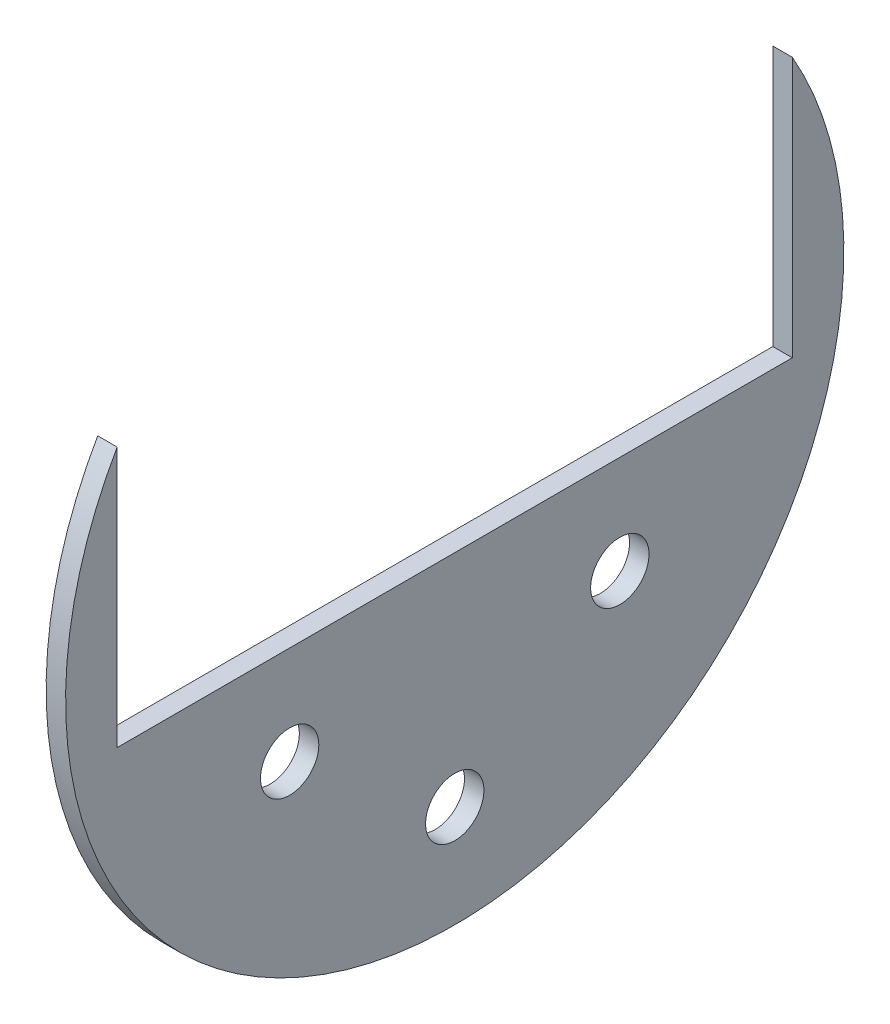
ISO-10303-21;
HEADER;
FILE_DESCRIPTION(('STEP AP214'),'2;1');
FILE_NAME('part.step','',(''),(''),'','','');
FILE_SCHEMA(('AUTOMOTIVE_DESIGN { 1 0 10303 214 1 1 1 1 }'));
ENDSEC;
DATA;
#1=APPLICATION_CONTEXT('core data for automotive mechanical design processes');
#2=APPLICATION_PROTOCOL_DEFINITION('international standard','automotive_design',2000,#1);
#3=PRODUCT_CONTEXT('',#1,'mechanical');
#4=PRODUCT('Part','Part','',(#3));
#5=PRODUCT_RELATED_PRODUCT_CATEGORY('part','',(#4));
#6=PRODUCT_DEFINITION_FORMATION('','',#4);
#7=PRODUCT_DEFINITION_CONTEXT('part definition',#1,'design');
#8=PRODUCT_DEFINITION('design','',#6,#7);
#9=PRODUCT_DEFINITION_SHAPE('','',#8);
#10=(LENGTH_UNIT() NAMED_UNIT(*) SI_UNIT(.MILLI.,.METRE.));
#11=(NAMED_UNIT(*) PLANE_ANGLE_UNIT() SI_UNIT($,.RADIAN.));
#12=(NAMED_UNIT(*) SI_UNIT($,.STERADIAN.) SOLID_ANGLE_UNIT());
#13=UNCERTAINTY_MEASURE_WITH_UNIT(LENGTH_MEASURE(1.E-05),#10,'distance_accuracy_value','');
#14=(GEOMETRIC_REPRESENTATION_CONTEXT(3) GLOBAL_UNCERTAINTY_ASSIGNED_CONTEXT((#13)) GLOBAL_UNIT_ASSIGNED_CONTEXT((#10,
#11,#12)) REPRESENTATION_CONTEXT('',''));
#15=CARTESIAN_POINT('',(0.,0.,0.));
#16=DIRECTION('',(0.,0.,1.));
#17=DIRECTION('',(1.,0.,0.));
#18=AXIS2_PLACEMENT_3D('',#15,#16,#17);
#19=CARTESIAN_POINT('',(1.,-8.48528137423807,-8.48528137423909));
#20=DIRECTION('',(-1.,0.,0.));
#21=DIRECTION('',(0.,0.,1.));
#22=AXIS2_PLACEMENT_3D('',#19,#20,#21);
#23=CYLINDRICAL_SURFACE('',#22,1.50000000000067);
#24=CARTESIAN_POINT('',(1.,-8.48528137423807,-8.48528137423909));
#25=DIRECTION('',(1.,0.,0.));
#26=DIRECTION('',(0.,0.,-1.));
#27=AXIS2_PLACEMENT_3D('',#24,#25,#26);
#28=CIRCLE('',#27,1.50000000000067);
#29=CARTESIAN_POINT('',(1.,-8.48528137423807,-9.98528137423976));
#30=VERTEX_POINT('',#29);
#31=EDGE_CURVE('E47',#30,#30,#28,.T.);
#32=ORIENTED_EDGE('',*,*,#31,.T.);
#33=EDGE_LOOP('',(#32));
#34=FACE_BOUND('',#33,.T.);
#35=CARTESIAN_POINT('',(0.,-8.48528137423807,-8.48528137423909));
#36=DIRECTION('',(1.,0.,0.));
#37=DIRECTION('',(0.,0.,-1.));
#38=AXIS2_PLACEMENT_3D('',#35,#36,#37);
#39=CIRCLE('',#38,1.50000000000067);
#40=CARTESIAN_POINT('',(0.,-8.48528137423807,-9.98528137423976));
#41=VERTEX_POINT('',#40);
#42=EDGE_CURVE('E112',#41,#41,#39,.T.);
#43=ORIENTED_EDGE('',*,*,#42,.F.);
#44=EDGE_LOOP('',(#43));
#45=FACE_BOUND('',#44,.T.);
#46=ADVANCED_FACE('F39',(#34,#45),#23,.F.);
#47=CARTESIAN_POINT('',(1.,-14.75,-8.33021366110691E-13));
#48=DIRECTION('',(-1.,0.,0.));
#49=DIRECTION('',(0.,0.,1.));
#50=AXIS2_PLACEMENT_3D('',#47,#48,#49);
#51=CYLINDRICAL_SURFACE('',#50,1.5000000000009);
#52=CARTESIAN_POINT('',(1.,-14.75,-8.33021366110691E-13));
#53=DIRECTION('',(1.,0.,0.));
#54=DIRECTION('',(0.,0.,-1.));
#55=AXIS2_PLACEMENT_3D('',#52,#53,#54);
#56=CIRCLE('',#55,1.5000000000009);
#57=CARTESIAN_POINT('',(1.,-14.75,-1.50000000000173));
#58=VERTEX_POINT('',#57);
#59=EDGE_CURVE('E111',#58,#58,#56,.T.);
#60=ORIENTED_EDGE('',*,*,#59,.T.);
#61=EDGE_LOOP('',(#60));
#62=FACE_BOUND('',#61,.T.);
#63=CARTESIAN_POINT('',(0.,-14.75,-8.33021366110691E-13));
#64=DIRECTION('',(1.,0.,0.));
#65=DIRECTION('',(0.,0.,-1.));
#66=AXIS2_PLACEMENT_3D('',#63,#64,#65);
#67=CIRCLE('',#66,1.5000000000009);
#68=CARTESIAN_POINT('',(0.,-14.75,-1.50000000000173));
#69=VERTEX_POINT('',#68);
#70=EDGE_CURVE('E122',#69,#69,#67,.T.);
#71=ORIENTED_EDGE('',*,*,#70,.F.);
#72=EDGE_LOOP('',(#71));
#73=FACE_BOUND('',#72,.T.);
#74=ADVANCED_FACE('F130',(#62,#73),#51,.F.);
#75=CARTESIAN_POINT('',(1.,-8.48528137423861,8.48528137423807));
#76=DIRECTION('',(-1.,0.,0.));
#77=DIRECTION('',(0.,0.,1.));
#78=AXIS2_PLACEMENT_3D('',#75,#76,#77);
#79=CYLINDRICAL_SURFACE('',#78,1.50000000000025);
#80=CARTESIAN_POINT('',(1.,-8.48528137423861,8.48528137423807));
#81=DIRECTION('',(1.,0.,0.));
#82=DIRECTION('',(0.,0.,-1.));
#83=AXIS2_PLACEMENT_3D('',#80,#81,#82);
#84=CIRCLE('',#83,1.50000000000025);
#85=CARTESIAN_POINT('',(1.,-8.48528137423861,6.98528137423781));
#86=VERTEX_POINT('',#85);
#87=EDGE_CURVE('E108',#86,#86,#84,.T.);
#88=ORIENTED_EDGE('',*,*,#87,.T.);
#89=EDGE_LOOP('',(#88));
#90=FACE_BOUND('',#89,.T.);
#91=CARTESIAN_POINT('',(0.,-8.48528137423861,8.48528137423807));
#92=DIRECTION('',(1.,0.,0.));
#93=DIRECTION('',(0.,0.,-1.));
#94=AXIS2_PLACEMENT_3D('',#91,#92,#93);
#95=CIRCLE('',#94,1.50000000000025);
#96=CARTESIAN_POINT('',(0.,-8.48528137423861,6.98528137423781));
#97=VERTEX_POINT('',#96);
#98=EDGE_CURVE('E107',#97,#97,#95,.T.);
#99=ORIENTED_EDGE('',*,*,#98,.F.);
#100=EDGE_LOOP('',(#99));
#101=FACE_BOUND('',#100,.T.);
#102=ADVANCED_FACE('F41',(#90,#101),#79,.F.);
#103=CARTESIAN_POINT('',(1.,0.,0.));
#104=DIRECTION('',(1.,0.,0.));
#105=DIRECTION('',(0.,0.,-1.));
#106=AXIS2_PLACEMENT_3D('',#103,#104,#105);
#107=PLANE('',#106);
#108=DIRECTION('',(0.,1.,5.54185086503495E-13));
#109=VECTOR('',#108,1.);
#110=CARTESIAN_POINT('',(1.,-3.42842712473658,-17.3500000000019));
#111=LINE('',#110,#109);
#112=CARTESIAN_POINT('',(1.,-3.42842712473658,-17.3500000000019));
#113=VERTEX_POINT('',#112);
#114=CARTESIAN_POINT('',(1.,9.94874363928388,-17.3499999999945));
#115=VERTEX_POINT('',#114);
#116=EDGE_CURVE('E96',#113,#115,#111,.T.);
#117=ORIENTED_EDGE('',*,*,#116,.F.);
#118=DIRECTION('',(0.,5.53986691614899E-13,-1.));
#119=VECTOR('',#118,1.);
#120=CARTESIAN_POINT('',(1.,-3.4284271247558,17.3499999999981));
#121=LINE('',#120,#119);
#122=CARTESIAN_POINT('',(1.,-3.4284271247558,17.3499999999981));
#123=VERTEX_POINT('',#122);
#124=EDGE_CURVE('E83',#123,#113,#121,.T.);
#125=ORIENTED_EDGE('',*,*,#124,.F.);
#126=DIRECTION('',(0.,-1.,-5.54185086503496E-13));
#127=VECTOR('',#126,1.);
#128=CARTESIAN_POINT('',(1.,17.3499999999904,17.3500000000096));
#129=LINE('',#128,#127);
#130=CARTESIAN_POINT('',(1.,9.94874363926465,17.3500000000055));
#131=VERTEX_POINT('',#130);
#132=EDGE_CURVE('E100',#131,#123,#129,.T.);
#133=ORIENTED_EDGE('',*,*,#132,.F.);
#134=CARTESIAN_POINT('',(1.,0.,0.));
#135=DIRECTION('',(1.,0.,0.));
#136=DIRECTION('',(0.,0.,-1.));
#137=AXIS2_PLACEMENT_3D('',#134,#135,#136);
#138=CIRCLE('',#137,20.);
#139=EDGE_CURVE('E115',#131,#115,#138,.T.);
#140=ORIENTED_EDGE('',*,*,#139,.T.);
#141=EDGE_LOOP('',(#117,#125,#133,#140));
#142=FACE_BOUND('',#141,.T.);
#143=ORIENTED_EDGE('',*,*,#87,.F.);
#144=EDGE_LOOP('',(#143));
#145=FACE_BOUND('',#144,.T.);
#146=ORIENTED_EDGE('',*,*,#59,.F.);
#147=EDGE_LOOP('',(#146));
#148=FACE_BOUND('',#147,.T.);
#149=ORIENTED_EDGE('',*,*,#31,.F.);
#150=EDGE_LOOP('',(#149));
#151=FACE_BOUND('',#150,.T.);
#152=ADVANCED_FACE('F152',(#142,#145,#148,#151),#107,.T.);
#153=CARTESIAN_POINT('',(0.,0.,0.));
#154=DIRECTION('',(1.,0.,0.));
#155=DIRECTION('',(0.,0.,-1.));
#156=AXIS2_PLACEMENT_3D('',#153,#154,#155);
#157=PLANE('',#156);
#158=ORIENTED_EDGE('',*,*,#98,.T.);
#159=EDGE_LOOP('',(#158));
#160=FACE_BOUND('',#159,.T.);
#161=ORIENTED_EDGE('',*,*,#70,.T.);
#162=EDGE_LOOP('',(#161));
#163=FACE_BOUND('',#162,.T.);
#164=DIRECTION('',(0.,5.53986691614899E-13,-1.));
#165=VECTOR('',#164,1.);
#166=CARTESIAN_POINT('',(0.,-3.4284271247558,17.3499999999981));
#167=LINE('',#166,#165);
#168=CARTESIAN_POINT('',(0.,-3.4284271247558,17.3499999999981));
#169=VERTEX_POINT('',#168);
#170=CARTESIAN_POINT('',(0.,-3.42842712473658,-17.3500000000019));
#171=VERTEX_POINT('',#170);
#172=EDGE_CURVE('E54',#169,#171,#167,.T.);
#173=ORIENTED_EDGE('',*,*,#172,.T.);
#174=DIRECTION('',(0.,1.,5.54185086503495E-13));
#175=VECTOR('',#174,1.);
#176=CARTESIAN_POINT('',(0.,-3.42842712473658,-17.3500000000019));
#177=LINE('',#176,#175);
#178=CARTESIAN_POINT('',(0.,9.94874363928388,-17.3499999999945));
#179=VERTEX_POINT('',#178);
#180=EDGE_CURVE('E88',#171,#179,#177,.T.);
#181=ORIENTED_EDGE('',*,*,#180,.T.);
#182=CARTESIAN_POINT('',(0.,0.,0.));
#183=DIRECTION('',(1.,0.,0.));
#184=DIRECTION('',(0.,0.,-1.));
#185=AXIS2_PLACEMENT_3D('',#182,#183,#184);
#186=CIRCLE('',#185,20.);
#187=CARTESIAN_POINT('',(0.,9.94874363926465,17.3500000000055));
#188=VERTEX_POINT('',#187);
#189=EDGE_CURVE('E125',#188,#179,#186,.T.);
#190=ORIENTED_EDGE('',*,*,#189,.F.);
#191=DIRECTION('',(0.,-1.,-5.54185086503496E-13));
#192=VECTOR('',#191,1.);
#193=CARTESIAN_POINT('',(0.,-9.61511125083565E-12,17.35));
#194=LINE('',#193,#192);
#195=EDGE_CURVE('E11',#188,#169,#194,.T.);
#196=ORIENTED_EDGE('',*,*,#195,.T.);
#197=EDGE_LOOP('',(#173,#181,#190,#196));
#198=FACE_BOUND('',#197,.T.);
#199=ORIENTED_EDGE('',*,*,#42,.T.);
#200=EDGE_LOOP('',(#199));
#201=FACE_BOUND('',#200,.T.);
#202=ADVANCED_FACE('F94',(#160,#163,#198,#201),#157,.F.);
#203=CARTESIAN_POINT('',(1.,0.,0.));
#204=DIRECTION('',(-1.,0.,0.));
#205=DIRECTION('',(0.,0.,1.));
#206=AXIS2_PLACEMENT_3D('',#203,#204,#205);
#207=CYLINDRICAL_SURFACE('',#206,20.);
#208=ORIENTED_EDGE('',*,*,#189,.T.);
#209=DIRECTION('',(-1.,0.,0.));
#210=VECTOR('',#209,1.);
#211=CARTESIAN_POINT('',(1.,9.94874363928388,-17.3499999999945));
#212=LINE('',#211,#210);
#213=EDGE_CURVE('E62',#179,#115,#212,.F.);
#214=ORIENTED_EDGE('',*,*,#213,.T.);
#215=ORIENTED_EDGE('',*,*,#139,.F.);
#216=DIRECTION('',(-1.,0.,0.));
#217=VECTOR('',#216,1.);
#218=CARTESIAN_POINT('',(1.,9.94874363926465,17.3500000000055));
#219=LINE('',#218,#217);
#220=EDGE_CURVE('E85',#131,#188,#219,.T.);
#221=ORIENTED_EDGE('',*,*,#220,.T.);
#222=EDGE_LOOP('',(#208,#214,#215,#221));
#223=FACE_BOUND('',#222,.T.);
#224=ADVANCED_FACE('F142',(#223),#207,.T.);
#225=CARTESIAN_POINT('',(0.,17.3499999999904,17.3500000000096));
#226=DIRECTION('',(0.,-5.54185086503496E-13,1.));
#227=DIRECTION('',(0.,-1.,-5.54185086503496E-13));
#228=AXIS2_PLACEMENT_3D('',#225,#226,#227);
#229=PLANE('',#228);
#230=ORIENTED_EDGE('',*,*,#132,.T.);
#231=DIRECTION('',(1.,0.,0.));
#232=VECTOR('',#231,1.);
#233=CARTESIAN_POINT('',(0.,-3.4284271247558,17.3499999999981));
#234=LINE('',#233,#232);
#235=EDGE_CURVE('E86',#169,#123,#234,.T.);
#236=ORIENTED_EDGE('',*,*,#235,.F.);
#237=ORIENTED_EDGE('',*,*,#195,.F.);
#238=ORIENTED_EDGE('',*,*,#220,.F.);
#239=EDGE_LOOP('',(#230,#236,#237,#238));
#240=FACE_BOUND('',#239,.T.);
#241=ADVANCED_FACE('F144',(#240),#229,.F.);
#242=CARTESIAN_POINT('',(0.,-3.4284271247558,17.3499999999981));
#243=DIRECTION('',(0.,-1.,-5.53986691614899E-13));
#244=DIRECTION('',(0.,5.53986691614899E-13,-1.));
#245=AXIS2_PLACEMENT_3D('',#242,#243,#244);
#246=PLANE('',#245);
#247=ORIENTED_EDGE('',*,*,#124,.T.);
#248=DIRECTION('',(1.,0.,0.));
#249=VECTOR('',#248,1.);
#250=CARTESIAN_POINT('',(0.,-3.42842712473658,-17.3500000000019));
#251=LINE('',#250,#249);
#252=EDGE_CURVE('E80',#171,#113,#251,.T.);
#253=ORIENTED_EDGE('',*,*,#252,.F.);
#254=ORIENTED_EDGE('',*,*,#172,.F.);
#255=ORIENTED_EDGE('',*,*,#235,.T.);
#256=EDGE_LOOP('',(#247,#253,#254,#255));
#257=FACE_BOUND('',#256,.T.);
#258=ADVANCED_FACE('F81',(#257),#246,.F.);
#259=CARTESIAN_POINT('',(0.,-3.42842712473658,-17.3500000000019));
#260=DIRECTION('',(0.,5.54185086503495E-13,-1.));
#261=DIRECTION('',(0.,1.,5.54185086503495E-13));
#262=AXIS2_PLACEMENT_3D('',#259,#260,#261);
#263=PLANE('',#262);
#264=ORIENTED_EDGE('',*,*,#180,.F.);
#265=ORIENTED_EDGE('',*,*,#252,.T.);
#266=ORIENTED_EDGE('',*,*,#116,.T.);
#267=ORIENTED_EDGE('',*,*,#213,.F.);
#268=EDGE_LOOP('',(#264,#265,#266,#267));
#269=FACE_BOUND('',#268,.T.);
#270=ADVANCED_FACE('F89',(#269),#263,.F.);
#271=CLOSED_SHELL('',(#46,#74,#102,#152,#202,#224,#241,#258,#270));
#272=MANIFOLD_SOLID_BREP('B2',#271);
#273=ADVANCED_BREP_SHAPE_REPRESENTATION('',(#18,#272),#14);
#274=SHAPE_DEFINITION_REPRESENTATION(#9,#273);
ENDSEC;
END-ISO-10303-21;
